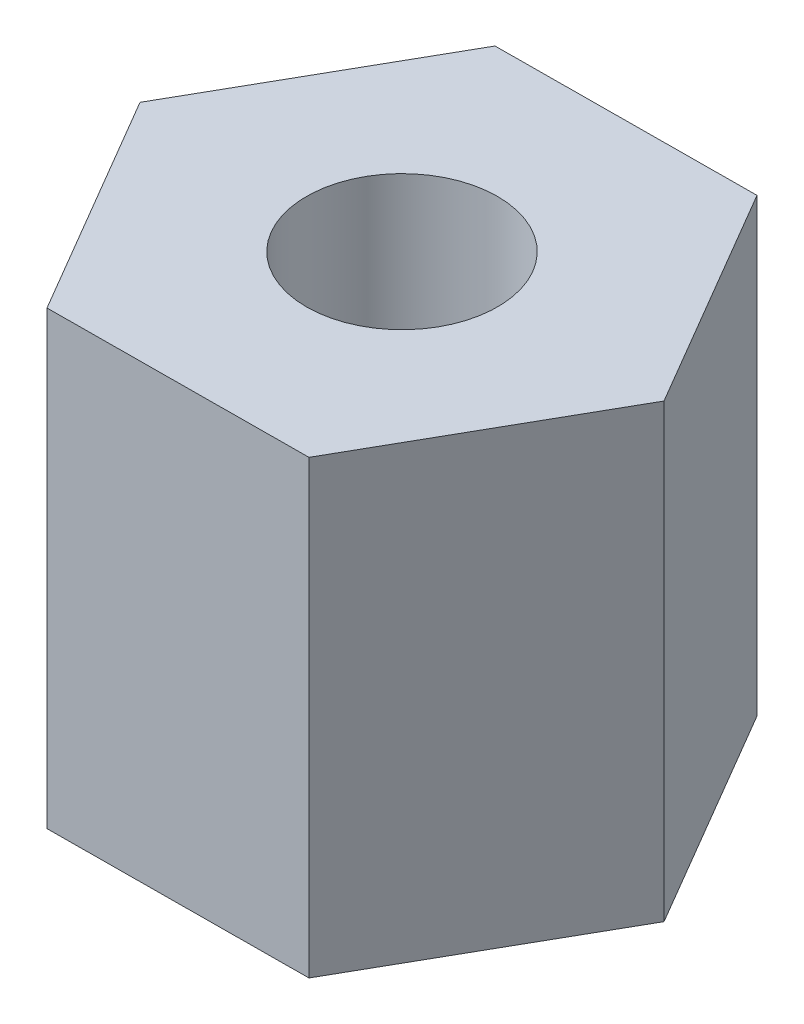
ISO-10303-21;
HEADER;
FILE_DESCRIPTION(('STEP AP214'),'2;1');
FILE_NAME('part.step','',(''),(''),'','','');
FILE_SCHEMA(('AUTOMOTIVE_DESIGN { 1 0 10303 214 1 1 1 1 }'));
ENDSEC;
DATA;
#1=APPLICATION_CONTEXT('core data for automotive mechanical design processes');
#2=APPLICATION_PROTOCOL_DEFINITION('international standard','automotive_design',2000,#1);
#3=PRODUCT_CONTEXT('',#1,'mechanical');
#4=PRODUCT('Part','Part','',(#3));
#5=PRODUCT_RELATED_PRODUCT_CATEGORY('part','',(#4));
#6=PRODUCT_DEFINITION_FORMATION('','',#4);
#7=PRODUCT_DEFINITION_CONTEXT('part definition',#1,'design');
#8=PRODUCT_DEFINITION('design','',#6,#7);
#9=PRODUCT_DEFINITION_SHAPE('','',#8);
#10=(LENGTH_UNIT() NAMED_UNIT(*) SI_UNIT(.MILLI.,.METRE.));
#11=(NAMED_UNIT(*) PLANE_ANGLE_UNIT() SI_UNIT($,.RADIAN.));
#12=(NAMED_UNIT(*) SI_UNIT($,.STERADIAN.) SOLID_ANGLE_UNIT());
#13=UNCERTAINTY_MEASURE_WITH_UNIT(LENGTH_MEASURE(1.E-05),#10,'distance_accuracy_value','');
#14=(GEOMETRIC_REPRESENTATION_CONTEXT(3) GLOBAL_UNCERTAINTY_ASSIGNED_CONTEXT((#13)) GLOBAL_UNIT_ASSIGNED_CONTEXT((#10,
#11,#12)) REPRESENTATION_CONTEXT('',''));
#15=CARTESIAN_POINT('',(0.,0.,0.));
#16=DIRECTION('',(0.,0.,1.));
#17=DIRECTION('',(1.,0.,0.));
#18=AXIS2_PLACEMENT_3D('',#15,#16,#17);
#19=CARTESIAN_POINT('',(0.,10.,0.));
#20=DIRECTION('',(0.,1.,0.));
#21=DIRECTION('',(0.,0.,1.));
#22=AXIS2_PLACEMENT_3D('',#19,#20,#21);
#23=PLANE('',#22);
#24=DIRECTION('',(0.999979578554637,0.,-0.0063908116613552));
#25=VECTOR('',#24,1.);
#26=CARTESIAN_POINT('',(-2.85473833600646,10.,5.0183465769383));
#27=LINE('',#26,#25);
#28=CARTESIAN_POINT('',(-2.85473833600646,10.,5.0183465769383));
#29=VERTEX_POINT('',#28);
#30=CARTESIAN_POINT('',(2.91864645262001,10.,4.98144920860807));
#31=VERTEX_POINT('',#30);
#32=EDGE_CURVE('E128',#29,#31,#27,.T.);
#33=ORIENTED_EDGE('',*,*,#32,.T.);
#34=DIRECTION('',(0.494455184027783,0.,-0.86920312412465));
#35=VECTOR('',#34,1.);
#36=CARTESIAN_POINT('',(2.91864645262001,10.,4.98144920860807));
#37=LINE('',#36,#35);
#38=CARTESIAN_POINT('',(5.77338478862648,10.,-0.0368973683302362));
#39=VERTEX_POINT('',#38);
#40=EDGE_CURVE('E86',#31,#39,#37,.T.);
#41=ORIENTED_EDGE('',*,*,#40,.T.);
#42=DIRECTION('',(-0.505524394526854,0.,-0.862812312463295));
#43=VECTOR('',#42,1.);
#44=CARTESIAN_POINT('',(5.77338478862648,10.,-0.0368973683302362));
#45=LINE('',#44,#43);
#46=CARTESIAN_POINT('',(2.85473833600646,10.,-5.0183465769383));
#47=VERTEX_POINT('',#46);
#48=EDGE_CURVE('E99',#39,#47,#45,.T.);
#49=ORIENTED_EDGE('',*,*,#48,.T.);
#50=DIRECTION('',(-0.999979578554637,0.,0.0063908116613549));
#51=VECTOR('',#50,1.);
#52=CARTESIAN_POINT('',(2.85473833600646,10.,-5.0183465769383));
#53=LINE('',#52,#51);
#54=CARTESIAN_POINT('',(-2.91864645262001,10.,-4.98144920860807));
#55=VERTEX_POINT('',#54);
#56=EDGE_CURVE('E93',#47,#55,#53,.T.);
#57=ORIENTED_EDGE('',*,*,#56,.T.);
#58=DIRECTION('',(-0.494455184027783,0.,0.86920312412465));
#59=VECTOR('',#58,1.);
#60=CARTESIAN_POINT('',(-2.91864645262001,10.,-4.98144920860807));
#61=LINE('',#60,#59);
#62=CARTESIAN_POINT('',(-5.77338478862648,10.,0.0368973683302366));
#63=VERTEX_POINT('',#62);
#64=EDGE_CURVE('E97',#55,#63,#61,.T.);
#65=ORIENTED_EDGE('',*,*,#64,.T.);
#66=DIRECTION('',(0.505524394526854,0.,0.862812312463295));
#67=VECTOR('',#66,1.);
#68=CARTESIAN_POINT('',(-5.77338478862648,10.,0.0368973683302366));
#69=LINE('',#68,#67);
#70=EDGE_CURVE('E49',#63,#29,#69,.T.);
#71=ORIENTED_EDGE('',*,*,#70,.T.);
#72=EDGE_LOOP('',(#33,#41,#49,#57,#65,#71));
#73=FACE_BOUND('',#72,.T.);
#74=CARTESIAN_POINT('',(0.,10.,0.));
#75=DIRECTION('',(0.,1.,0.));
#76=DIRECTION('',(0.,0.,1.));
#77=AXIS2_PLACEMENT_3D('',#74,#75,#76);
#78=CIRCLE('',#77,2.1209);
#79=CARTESIAN_POINT('',(0.,10.,2.1209));
#80=VERTEX_POINT('',#79);
#81=EDGE_CURVE('E121',#80,#80,#78,.T.);
#82=ORIENTED_EDGE('',*,*,#81,.F.);
#83=EDGE_LOOP('',(#82));
#84=FACE_BOUND('',#83,.T.);
#85=ADVANCED_FACE('F32',(#73,#84),#23,.T.);
#86=CARTESIAN_POINT('',(0.,0.,0.));
#87=DIRECTION('',(0.,1.,0.));
#88=DIRECTION('',(0.,0.,1.));
#89=AXIS2_PLACEMENT_3D('',#86,#87,#88);
#90=PLANE('',#89);
#91=DIRECTION('',(0.999979578554637,0.,-0.0063908116613552));
#92=VECTOR('',#91,1.);
#93=CARTESIAN_POINT('',(-2.85473833600646,0.,5.0183465769383));
#94=LINE('',#93,#92);
#95=CARTESIAN_POINT('',(-2.85473833600646,0.,5.0183465769383));
#96=VERTEX_POINT('',#95);
#97=CARTESIAN_POINT('',(2.91864645262001,0.,4.98144920860807));
#98=VERTEX_POINT('',#97);
#99=EDGE_CURVE('E117',#96,#98,#94,.T.);
#100=ORIENTED_EDGE('',*,*,#99,.F.);
#101=DIRECTION('',(0.505524394526854,0.,0.862812312463295));
#102=VECTOR('',#101,1.);
#103=CARTESIAN_POINT('',(-5.77338478862648,0.,0.0368973683302366));
#104=LINE('',#103,#102);
#105=CARTESIAN_POINT('',(-5.77338478862648,0.,0.0368973683302366));
#106=VERTEX_POINT('',#105);
#107=EDGE_CURVE('E78',#106,#96,#104,.T.);
#108=ORIENTED_EDGE('',*,*,#107,.F.);
#109=DIRECTION('',(-0.494455184027783,0.,0.86920312412465));
#110=VECTOR('',#109,1.);
#111=CARTESIAN_POINT('',(-2.91864645262001,0.,-4.98144920860807));
#112=LINE('',#111,#110);
#113=CARTESIAN_POINT('',(-2.91864645262001,0.,-4.98144920860807));
#114=VERTEX_POINT('',#113);
#115=EDGE_CURVE('E72',#114,#106,#112,.T.);
#116=ORIENTED_EDGE('',*,*,#115,.F.);
#117=DIRECTION('',(-0.999979578554637,0.,0.0063908116613549));
#118=VECTOR('',#117,1.);
#119=CARTESIAN_POINT('',(2.85473833600646,0.,-5.0183465769383));
#120=LINE('',#119,#118);
#121=CARTESIAN_POINT('',(2.85473833600646,0.,-5.0183465769383));
#122=VERTEX_POINT('',#121);
#123=EDGE_CURVE('E107',#122,#114,#120,.T.);
#124=ORIENTED_EDGE('',*,*,#123,.F.);
#125=DIRECTION('',(-0.505524394526854,0.,-0.862812312463295));
#126=VECTOR('',#125,1.);
#127=CARTESIAN_POINT('',(5.77338478862648,0.,-0.0368973683302362));
#128=LINE('',#127,#126);
#129=CARTESIAN_POINT('',(5.77338478862648,0.,-0.0368973683302362));
#130=VERTEX_POINT('',#129);
#131=EDGE_CURVE('E123',#130,#122,#128,.T.);
#132=ORIENTED_EDGE('',*,*,#131,.F.);
#133=DIRECTION('',(0.494455184027783,0.,-0.86920312412465));
#134=VECTOR('',#133,1.);
#135=CARTESIAN_POINT('',(2.91864645262001,0.,4.98144920860807));
#136=LINE('',#135,#134);
#137=EDGE_CURVE('E120',#98,#130,#136,.T.);
#138=ORIENTED_EDGE('',*,*,#137,.F.);
#139=EDGE_LOOP('',(#100,#108,#116,#124,#132,#138));
#140=FACE_BOUND('',#139,.T.);
#141=CARTESIAN_POINT('',(0.,0.,0.));
#142=DIRECTION('',(0.,1.,0.));
#143=DIRECTION('',(0.,0.,1.));
#144=AXIS2_PLACEMENT_3D('',#141,#142,#143);
#145=CIRCLE('',#144,2.1209);
#146=CARTESIAN_POINT('',(0.,0.,2.1209));
#147=VERTEX_POINT('',#146);
#148=EDGE_CURVE('E221',#147,#147,#145,.T.);
#149=ORIENTED_EDGE('',*,*,#148,.T.);
#150=EDGE_LOOP('',(#149));
#151=FACE_BOUND('',#150,.T.);
#152=ADVANCED_FACE('F137',(#140,#151),#90,.F.);
#153=CARTESIAN_POINT('',(-2.85473833600646,10.,5.0183465769383));
#154=DIRECTION('',(-0.0063908116613552,0.,-0.999979578554637));
#155=DIRECTION('',(-0.999979578554637,0.,0.0063908116613552));
#156=AXIS2_PLACEMENT_3D('',#153,#154,#155);
#157=PLANE('',#156);
#158=ORIENTED_EDGE('',*,*,#99,.T.);
#159=DIRECTION('',(0.,-1.,0.));
#160=VECTOR('',#159,1.);
#161=CARTESIAN_POINT('',(2.91864645262001,10.,4.98144920860807));
#162=LINE('',#161,#160);
#163=EDGE_CURVE('E11',#31,#98,#162,.T.);
#164=ORIENTED_EDGE('',*,*,#163,.F.);
#165=ORIENTED_EDGE('',*,*,#32,.F.);
#166=DIRECTION('',(0.,-1.,0.));
#167=VECTOR('',#166,1.);
#168=CARTESIAN_POINT('',(-2.85473833600646,10.,5.0183465769383));
#169=LINE('',#168,#167);
#170=EDGE_CURVE('E113',#29,#96,#169,.T.);
#171=ORIENTED_EDGE('',*,*,#170,.T.);
#172=EDGE_LOOP('',(#158,#164,#165,#171));
#173=FACE_BOUND('',#172,.T.);
#174=ADVANCED_FACE('F34',(#173),#157,.F.);
#175=CARTESIAN_POINT('',(2.91864645262001,10.,4.98144920860807));
#176=DIRECTION('',(-0.86920312412465,0.,-0.494455184027783));
#177=DIRECTION('',(-0.494455184027783,0.,0.86920312412465));
#178=AXIS2_PLACEMENT_3D('',#175,#176,#177);
#179=PLANE('',#178);
#180=ORIENTED_EDGE('',*,*,#137,.T.);
#181=DIRECTION('',(0.,-1.,0.));
#182=VECTOR('',#181,1.);
#183=CARTESIAN_POINT('',(5.77338478862648,10.,-0.0368973683302362));
#184=LINE('',#183,#182);
#185=EDGE_CURVE('E41',#39,#130,#184,.T.);
#186=ORIENTED_EDGE('',*,*,#185,.F.);
#187=ORIENTED_EDGE('',*,*,#40,.F.);
#188=ORIENTED_EDGE('',*,*,#163,.T.);
#189=EDGE_LOOP('',(#180,#186,#187,#188));
#190=FACE_BOUND('',#189,.T.);
#191=ADVANCED_FACE('F162',(#190),#179,.F.);
#192=CARTESIAN_POINT('',(5.77338478862648,10.,-0.0368973683302362));
#193=DIRECTION('',(-0.862812312463295,0.,0.505524394526854));
#194=DIRECTION('',(0.505524394526854,0.,0.862812312463295));
#195=AXIS2_PLACEMENT_3D('',#192,#193,#194);
#196=PLANE('',#195);
#197=ORIENTED_EDGE('',*,*,#131,.T.);
#198=DIRECTION('',(0.,-1.,0.));
#199=VECTOR('',#198,1.);
#200=CARTESIAN_POINT('',(2.85473833600646,10.,-5.0183465769383));
#201=LINE('',#200,#199);
#202=EDGE_CURVE('E108',#47,#122,#201,.T.);
#203=ORIENTED_EDGE('',*,*,#202,.F.);
#204=ORIENTED_EDGE('',*,*,#48,.F.);
#205=ORIENTED_EDGE('',*,*,#185,.T.);
#206=EDGE_LOOP('',(#197,#203,#204,#205));
#207=FACE_BOUND('',#206,.T.);
#208=ADVANCED_FACE('F134',(#207),#196,.F.);
#209=CARTESIAN_POINT('',(2.85473833600646,10.,-5.0183465769383));
#210=DIRECTION('',(0.0063908116613549,0.,0.999979578554637));
#211=DIRECTION('',(0.999979578554637,0.,-0.0063908116613549));
#212=AXIS2_PLACEMENT_3D('',#209,#210,#211);
#213=PLANE('',#212);
#214=ORIENTED_EDGE('',*,*,#123,.T.);
#215=DIRECTION('',(0.,-1.,0.));
#216=VECTOR('',#215,1.);
#217=CARTESIAN_POINT('',(-2.91864645262001,10.,-4.98144920860807));
#218=LINE('',#217,#216);
#219=EDGE_CURVE('E104',#55,#114,#218,.T.);
#220=ORIENTED_EDGE('',*,*,#219,.F.);
#221=ORIENTED_EDGE('',*,*,#56,.F.);
#222=ORIENTED_EDGE('',*,*,#202,.T.);
#223=EDGE_LOOP('',(#214,#220,#221,#222));
#224=FACE_BOUND('',#223,.T.);
#225=ADVANCED_FACE('F105',(#224),#213,.F.);
#226=CARTESIAN_POINT('',(-2.91864645262001,10.,-4.98144920860807));
#227=DIRECTION('',(0.86920312412465,0.,0.494455184027783));
#228=DIRECTION('',(0.494455184027783,0.,-0.86920312412465));
#229=AXIS2_PLACEMENT_3D('',#226,#227,#228);
#230=PLANE('',#229);
#231=ORIENTED_EDGE('',*,*,#115,.T.);
#232=DIRECTION('',(0.,-1.,0.));
#233=VECTOR('',#232,1.);
#234=CARTESIAN_POINT('',(-5.77338478862648,10.,0.0368973683302366));
#235=LINE('',#234,#233);
#236=EDGE_CURVE('E109',#63,#106,#235,.T.);
#237=ORIENTED_EDGE('',*,*,#236,.F.);
#238=ORIENTED_EDGE('',*,*,#64,.F.);
#239=ORIENTED_EDGE('',*,*,#219,.T.);
#240=EDGE_LOOP('',(#231,#237,#238,#239));
#241=FACE_BOUND('',#240,.T.);
#242=ADVANCED_FACE('F111',(#241),#230,.F.);
#243=CARTESIAN_POINT('',(-5.77338478862648,10.,0.0368973683302366));
#244=DIRECTION('',(0.862812312463295,0.,-0.505524394526854));
#245=DIRECTION('',(-0.505524394526854,0.,-0.862812312463295));
#246=AXIS2_PLACEMENT_3D('',#243,#244,#245);
#247=PLANE('',#246);
#248=ORIENTED_EDGE('',*,*,#107,.T.);
#249=ORIENTED_EDGE('',*,*,#170,.F.);
#250=ORIENTED_EDGE('',*,*,#70,.F.);
#251=ORIENTED_EDGE('',*,*,#236,.T.);
#252=EDGE_LOOP('',(#248,#249,#250,#251));
#253=FACE_BOUND('',#252,.T.);
#254=ADVANCED_FACE('F142',(#253),#247,.F.);
#255=CARTESIAN_POINT('',(0.,10.,0.));
#256=DIRECTION('',(0.,-1.,0.));
#257=DIRECTION('',(0.,0.,-1.));
#258=AXIS2_PLACEMENT_3D('',#255,#256,#257);
#259=CYLINDRICAL_SURFACE('',#258,2.1209);
#260=ORIENTED_EDGE('',*,*,#81,.T.);
#261=EDGE_LOOP('',(#260));
#262=FACE_BOUND('',#261,.T.);
#263=ORIENTED_EDGE('',*,*,#148,.F.);
#264=EDGE_LOOP('',(#263));
#265=FACE_BOUND('',#264,.T.);
#266=ADVANCED_FACE('F144',(#262,#265),#259,.F.);
#267=CLOSED_SHELL('',(#85,#152,#174,#191,#208,#225,#242,#254,#266));
#268=MANIFOLD_SOLID_BREP('B2',#267);
#269=ADVANCED_BREP_SHAPE_REPRESENTATION('',(#18,#268),#14);
#270=SHAPE_DEFINITION_REPRESENTATION(#9,#269);
ENDSEC;
END-ISO-10303-21;
